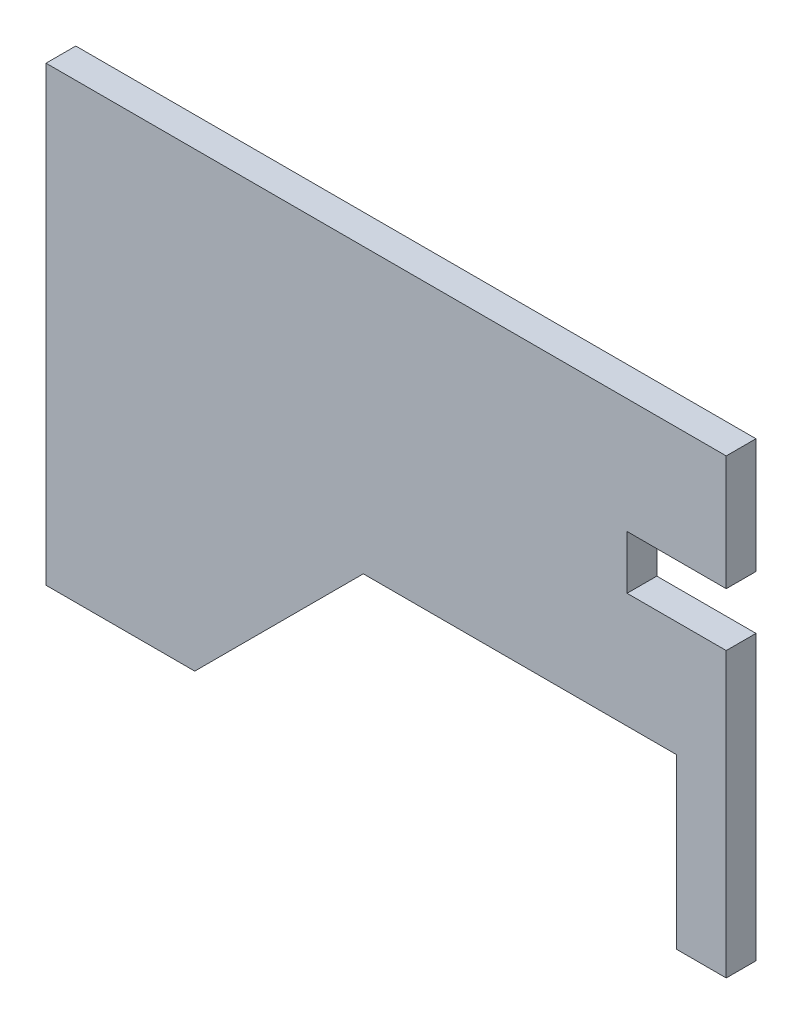
ISO-10303-21;
HEADER;
FILE_DESCRIPTION(('STEP AP214'),'2;1');
FILE_NAME('part.step','',(''),(''),'','','');
FILE_SCHEMA(('AUTOMOTIVE_DESIGN { 1 0 10303 214 1 1 1 1 }'));
ENDSEC;
DATA;
#1=APPLICATION_CONTEXT('core data for automotive mechanical design processes');
#2=APPLICATION_PROTOCOL_DEFINITION('international standard','automotive_design',2000,#1);
#3=PRODUCT_CONTEXT('',#1,'mechanical');
#4=PRODUCT('Part','Part','',(#3));
#5=PRODUCT_RELATED_PRODUCT_CATEGORY('part','',(#4));
#6=PRODUCT_DEFINITION_FORMATION('','',#4);
#7=PRODUCT_DEFINITION_CONTEXT('part definition',#1,'design');
#8=PRODUCT_DEFINITION('design','',#6,#7);
#9=PRODUCT_DEFINITION_SHAPE('','',#8);
#10=(LENGTH_UNIT() NAMED_UNIT(*) SI_UNIT(.MILLI.,.METRE.));
#11=(NAMED_UNIT(*) PLANE_ANGLE_UNIT() SI_UNIT($,.RADIAN.));
#12=(NAMED_UNIT(*) SI_UNIT($,.STERADIAN.) SOLID_ANGLE_UNIT());
#13=UNCERTAINTY_MEASURE_WITH_UNIT(LENGTH_MEASURE(1.E-05),#10,'distance_accuracy_value','');
#14=(GEOMETRIC_REPRESENTATION_CONTEXT(3) GLOBAL_UNCERTAINTY_ASSIGNED_CONTEXT((#13)) GLOBAL_UNIT_ASSIGNED_CONTEXT((#10,
#11,#12)) REPRESENTATION_CONTEXT('',''));
#15=CARTESIAN_POINT('',(0.,0.,0.));
#16=DIRECTION('',(0.,0.,1.));
#17=DIRECTION('',(1.,0.,0.));
#18=AXIS2_PLACEMENT_3D('',#15,#16,#17);
#19=CARTESIAN_POINT('',(0.,0.,0.));
#20=DIRECTION('',(0.,0.,1.));
#21=DIRECTION('',(1.,0.,0.));
#22=AXIS2_PLACEMENT_3D('',#19,#20,#21);
#23=PLANE('',#22);
#24=DIRECTION('',(0.,1.,0.));
#25=VECTOR('',#24,1.);
#26=CARTESIAN_POINT('',(23.,1.,0.));
#27=LINE('',#26,#25);
#28=CARTESIAN_POINT('',(23.,1.,0.));
#29=VERTEX_POINT('',#28);
#30=CARTESIAN_POINT('',(23.,4.6,0.));
#31=VERTEX_POINT('',#30);
#32=EDGE_CURVE('E216',#29,#31,#27,.T.);
#33=ORIENTED_EDGE('',*,*,#32,.F.);
#34=DIRECTION('',(1.,0.,0.));
#35=VECTOR('',#34,1.);
#36=CARTESIAN_POINT('',(26.,1.,0.));
#37=LINE('',#36,#35);
#38=CARTESIAN_POINT('',(-23.,0.999999999999993,0.));
#39=VERTEX_POINT('',#38);
#40=EDGE_CURVE('E340',#39,#29,#37,.T.);
#41=ORIENTED_EDGE('',*,*,#40,.F.);
#42=DIRECTION('',(0.,-1.,0.));
#43=VECTOR('',#42,1.);
#44=CARTESIAN_POINT('',(-23.,4.59999999999999,0.));
#45=LINE('',#44,#43);
#46=CARTESIAN_POINT('',(-23.,4.59999999999999,0.));
#47=VERTEX_POINT('',#46);
#48=EDGE_CURVE('E231',#47,#39,#45,.T.);
#49=ORIENTED_EDGE('',*,*,#48,.F.);
#50=DIRECTION('',(1.,0.,0.));
#51=VECTOR('',#50,1.);
#52=CARTESIAN_POINT('',(-23.,4.59999999999999,0.));
#53=LINE('',#52,#51);
#54=CARTESIAN_POINT('',(-26.,4.59999999999999,0.));
#55=VERTEX_POINT('',#54);
#56=EDGE_CURVE('E166',#55,#47,#53,.T.);
#57=ORIENTED_EDGE('',*,*,#56,.F.);
#58=DIRECTION('',(0.,-1.,0.));
#59=VECTOR('',#58,1.);
#60=CARTESIAN_POINT('',(-26.,11.,0.));
#61=LINE('',#60,#59);
#62=CARTESIAN_POINT('',(-26.,11.,0.));
#63=VERTEX_POINT('',#62);
#64=EDGE_CURVE('E228',#63,#55,#61,.T.);
#65=ORIENTED_EDGE('',*,*,#64,.F.);
#66=DIRECTION('',(-1.,0.,0.));
#67=VECTOR('',#66,1.);
#68=CARTESIAN_POINT('',(-26.,11.,0.));
#69=LINE('',#68,#67);
#70=CARTESIAN_POINT('',(36.,11.,0.));
#71=VERTEX_POINT('',#70);
#72=EDGE_CURVE('E226',#71,#63,#69,.T.);
#73=ORIENTED_EDGE('',*,*,#72,.F.);
#74=DIRECTION('',(0.,1.,0.));
#75=VECTOR('',#74,1.);
#76=CARTESIAN_POINT('',(36.,6.00000000000001,0.));
#77=LINE('',#76,#75);
#78=CARTESIAN_POINT('',(36.,6.00000000000001,0.));
#79=VERTEX_POINT('',#78);
#80=EDGE_CURVE('E224',#79,#71,#77,.T.);
#81=ORIENTED_EDGE('',*,*,#80,.F.);
#82=DIRECTION('',(1.,0.,0.));
#83=VECTOR('',#82,1.);
#84=CARTESIAN_POINT('',(36.,6.00000000000001,0.));
#85=LINE('',#84,#83);
#86=CARTESIAN_POINT('',(26.,6.00000000000001,0.));
#87=VERTEX_POINT('',#86);
#88=EDGE_CURVE('E222',#87,#79,#85,.T.);
#89=ORIENTED_EDGE('',*,*,#88,.F.);
#90=DIRECTION('',(0.,1.,0.));
#91=VECTOR('',#90,1.);
#92=CARTESIAN_POINT('',(26.,6.00000000000001,0.));
#93=LINE('',#92,#91);
#94=CARTESIAN_POINT('',(26.,4.6,0.));
#95=VERTEX_POINT('',#94);
#96=EDGE_CURVE('E220',#95,#87,#93,.T.);
#97=ORIENTED_EDGE('',*,*,#96,.F.);
#98=DIRECTION('',(1.,0.,0.));
#99=VECTOR('',#98,1.);
#100=CARTESIAN_POINT('',(23.,4.6,0.));
#101=LINE('',#100,#99);
#102=EDGE_CURVE('E218',#31,#95,#101,.T.);
#103=ORIENTED_EDGE('',*,*,#102,.F.);
#104=EDGE_LOOP('',(#33,#41,#49,#57,#65,#73,#81,#89,#97,#103));
#105=FACE_BOUND('',#104,.T.);
#106=ADVANCED_FACE('F33',(#105),#23,.F.);
#107=CARTESIAN_POINT('',(-26.,-11.,2.4));
#108=DIRECTION('',(1.,0.,0.));
#109=DIRECTION('',(0.,0.,-1.));
#110=AXIS2_PLACEMENT_3D('',#107,#108,#109);
#111=PLANE('',#110);
#112=DIRECTION('',(0.,-1.,0.));
#113=VECTOR('',#112,1.);
#114=CARTESIAN_POINT('',(-26.,-11.,0.));
#115=LINE('',#114,#113);
#116=CARTESIAN_POINT('',(-26.,-4.6,0.));
#117=VERTEX_POINT('',#116);
#118=CARTESIAN_POINT('',(-26.,-11.,0.));
#119=VERTEX_POINT('',#118);
#120=EDGE_CURVE('E199',#117,#119,#115,.T.);
#121=ORIENTED_EDGE('',*,*,#120,.T.);
#122=DIRECTION('',(0.,0.,-1.));
#123=VECTOR('',#122,1.);
#124=CARTESIAN_POINT('',(-26.,-11.,2.4));
#125=LINE('',#124,#123);
#126=CARTESIAN_POINT('',(-26.,-11.,2.4));
#127=VERTEX_POINT('',#126);
#128=EDGE_CURVE('E11',#127,#119,#125,.T.);
#129=ORIENTED_EDGE('',*,*,#128,.F.);
#130=DIRECTION('',(0.,-1.,0.));
#131=VECTOR('',#130,1.);
#132=CARTESIAN_POINT('',(-26.,-11.,2.4));
#133=LINE('',#132,#131);
#134=CARTESIAN_POINT('',(-26.,-4.6,2.4));
#135=VERTEX_POINT('',#134);
#136=EDGE_CURVE('E235',#135,#127,#133,.T.);
#137=ORIENTED_EDGE('',*,*,#136,.F.);
#138=DIRECTION('',(0.,0.,-1.));
#139=VECTOR('',#138,1.);
#140=CARTESIAN_POINT('',(-26.,-4.6,2.4));
#141=LINE('',#140,#139);
#142=EDGE_CURVE('E198',#135,#117,#141,.T.);
#143=ORIENTED_EDGE('',*,*,#142,.T.);
#144=EDGE_LOOP('',(#121,#129,#137,#143));
#145=FACE_BOUND('',#144,.T.);
#146=ADVANCED_FACE('F35',(#145),#111,.F.);
#147=CARTESIAN_POINT('',(-26.,-11.,2.4));
#148=DIRECTION('',(0.,1.,0.));
#149=DIRECTION('',(0.,0.,1.));
#150=AXIS2_PLACEMENT_3D('',#147,#148,#149);
#151=PLANE('',#150);
#152=DIRECTION('',(1.,0.,0.));
#153=VECTOR('',#152,1.);
#154=CARTESIAN_POINT('',(-26.,-11.,0.));
#155=LINE('',#154,#153);
#156=CARTESIAN_POINT('',(36.,-11.,0.));
#157=VERTEX_POINT('',#156);
#158=EDGE_CURVE('E202',#119,#157,#155,.T.);
#159=ORIENTED_EDGE('',*,*,#158,.T.);
#160=DIRECTION('',(0.,0.,-1.));
#161=VECTOR('',#160,1.);
#162=CARTESIAN_POINT('',(36.,-11.,2.4));
#163=LINE('',#162,#161);
#164=CARTESIAN_POINT('',(36.,-11.,2.4));
#165=VERTEX_POINT('',#164);
#166=EDGE_CURVE('E42',#165,#157,#163,.T.);
#167=ORIENTED_EDGE('',*,*,#166,.F.);
#168=DIRECTION('',(1.,0.,0.));
#169=VECTOR('',#168,1.);
#170=CARTESIAN_POINT('',(-26.,-11.,2.4));
#171=LINE('',#170,#169);
#172=EDGE_CURVE('E116',#127,#165,#171,.T.);
#173=ORIENTED_EDGE('',*,*,#172,.F.);
#174=ORIENTED_EDGE('',*,*,#128,.T.);
#175=EDGE_LOOP('',(#159,#167,#173,#174));
#176=FACE_BOUND('',#175,.T.);
#177=ADVANCED_FACE('F538',(#176),#151,.F.);
#178=CARTESIAN_POINT('',(36.,-6.,2.4));
#179=DIRECTION('',(-1.,0.,0.));
#180=DIRECTION('',(0.,0.,1.));
#181=AXIS2_PLACEMENT_3D('',#178,#179,#180);
#182=PLANE('',#181);
#183=DIRECTION('',(0.,1.,0.));
#184=VECTOR('',#183,1.);
#185=CARTESIAN_POINT('',(36.,-6.,0.));
#186=LINE('',#185,#184);
#187=CARTESIAN_POINT('',(36.,-6.,0.));
#188=VERTEX_POINT('',#187);
#189=EDGE_CURVE('E205',#157,#188,#186,.T.);
#190=ORIENTED_EDGE('',*,*,#189,.T.);
#191=DIRECTION('',(0.,0.,-1.));
#192=VECTOR('',#191,1.);
#193=CARTESIAN_POINT('',(36.,-6.,2.4));
#194=LINE('',#193,#192);
#195=CARTESIAN_POINT('',(36.,-6.,2.4));
#196=VERTEX_POINT('',#195);
#197=EDGE_CURVE('E275',#196,#188,#194,.T.);
#198=ORIENTED_EDGE('',*,*,#197,.F.);
#199=DIRECTION('',(0.,1.,0.));
#200=VECTOR('',#199,1.);
#201=CARTESIAN_POINT('',(36.,-6.,2.4));
#202=LINE('',#201,#200);
#203=EDGE_CURVE('E283',#165,#196,#202,.T.);
#204=ORIENTED_EDGE('',*,*,#203,.F.);
#205=ORIENTED_EDGE('',*,*,#166,.T.);
#206=EDGE_LOOP('',(#190,#198,#204,#205));
#207=FACE_BOUND('',#206,.T.);
#208=ADVANCED_FACE('F281',(#207),#182,.F.);
#209=CARTESIAN_POINT('',(36.,-6.,2.4));
#210=DIRECTION('',(0.,-1.,0.));
#211=DIRECTION('',(0.,0.,-1.));
#212=AXIS2_PLACEMENT_3D('',#209,#210,#211);
#213=PLANE('',#212);
#214=DIRECTION('',(-1.,0.,0.));
#215=VECTOR('',#214,1.);
#216=CARTESIAN_POINT('',(36.,-6.,0.));
#217=LINE('',#216,#215);
#218=CARTESIAN_POINT('',(26.,-6.,0.));
#219=VERTEX_POINT('',#218);
#220=EDGE_CURVE('E207',#188,#219,#217,.T.);
#221=ORIENTED_EDGE('',*,*,#220,.T.);
#222=DIRECTION('',(0.,0.,-1.));
#223=VECTOR('',#222,1.);
#224=CARTESIAN_POINT('',(26.,-6.,2.4));
#225=LINE('',#224,#223);
#226=CARTESIAN_POINT('',(26.,-6.,2.4));
#227=VERTEX_POINT('',#226);
#228=EDGE_CURVE('E272',#227,#219,#225,.T.);
#229=ORIENTED_EDGE('',*,*,#228,.F.);
#230=DIRECTION('',(-1.,0.,0.));
#231=VECTOR('',#230,1.);
#232=CARTESIAN_POINT('',(36.,-6.,2.4));
#233=LINE('',#232,#231);
#234=EDGE_CURVE('E302',#196,#227,#233,.T.);
#235=ORIENTED_EDGE('',*,*,#234,.F.);
#236=ORIENTED_EDGE('',*,*,#197,.T.);
#237=EDGE_LOOP('',(#221,#229,#235,#236));
#238=FACE_BOUND('',#237,.T.);
#239=ADVANCED_FACE('F291',(#238),#213,.F.);
#240=CARTESIAN_POINT('',(26.,-6.,2.4));
#241=DIRECTION('',(-1.,0.,0.));
#242=DIRECTION('',(0.,0.,1.));
#243=AXIS2_PLACEMENT_3D('',#240,#241,#242);
#244=PLANE('',#243);
#245=DIRECTION('',(0.,1.,0.));
#246=VECTOR('',#245,1.);
#247=CARTESIAN_POINT('',(26.,-6.,0.));
#248=LINE('',#247,#246);
#249=CARTESIAN_POINT('',(26.,-4.6,0.));
#250=VERTEX_POINT('',#249);
#251=EDGE_CURVE('E209',#219,#250,#248,.T.);
#252=ORIENTED_EDGE('',*,*,#251,.T.);
#253=DIRECTION('',(0.,0.,-1.));
#254=VECTOR('',#253,1.);
#255=CARTESIAN_POINT('',(26.,-4.6,2.4));
#256=LINE('',#255,#254);
#257=CARTESIAN_POINT('',(26.,-4.6,2.4));
#258=VERTEX_POINT('',#257);
#259=EDGE_CURVE('E269',#258,#250,#256,.T.);
#260=ORIENTED_EDGE('',*,*,#259,.F.);
#261=DIRECTION('',(0.,1.,0.));
#262=VECTOR('',#261,1.);
#263=CARTESIAN_POINT('',(26.,-6.,2.4));
#264=LINE('',#263,#262);
#265=EDGE_CURVE('E297',#227,#258,#264,.T.);
#266=ORIENTED_EDGE('',*,*,#265,.F.);
#267=ORIENTED_EDGE('',*,*,#228,.T.);
#268=EDGE_LOOP('',(#252,#260,#266,#267));
#269=FACE_BOUND('',#268,.T.);
#270=ADVANCED_FACE('F295',(#269),#244,.F.);
#271=CARTESIAN_POINT('',(23.,-4.6,2.4));
#272=DIRECTION('',(0.,-1.,0.));
#273=DIRECTION('',(0.,0.,-1.));
#274=AXIS2_PLACEMENT_3D('',#271,#272,#273);
#275=PLANE('',#274);
#276=DIRECTION('',(-1.,0.,0.));
#277=VECTOR('',#276,1.);
#278=CARTESIAN_POINT('',(23.,-4.6,0.));
#279=LINE('',#278,#277);
#280=CARTESIAN_POINT('',(23.,-4.6,0.));
#281=VERTEX_POINT('',#280);
#282=EDGE_CURVE('E211',#250,#281,#279,.T.);
#283=ORIENTED_EDGE('',*,*,#282,.T.);
#284=DIRECTION('',(0.,0.,-1.));
#285=VECTOR('',#284,1.);
#286=CARTESIAN_POINT('',(23.,-4.6,2.4));
#287=LINE('',#286,#285);
#288=CARTESIAN_POINT('',(23.,-4.6,2.4));
#289=VERTEX_POINT('',#288);
#290=EDGE_CURVE('E266',#289,#281,#287,.T.);
#291=ORIENTED_EDGE('',*,*,#290,.F.);
#292=DIRECTION('',(-1.,0.,0.));
#293=VECTOR('',#292,1.);
#294=CARTESIAN_POINT('',(23.,-4.6,2.4));
#295=LINE('',#294,#293);
#296=EDGE_CURVE('E301',#258,#289,#295,.T.);
#297=ORIENTED_EDGE('',*,*,#296,.F.);
#298=ORIENTED_EDGE('',*,*,#259,.T.);
#299=EDGE_LOOP('',(#283,#291,#297,#298));
#300=FACE_BOUND('',#299,.T.);
#301=ADVANCED_FACE('F501',(#300),#275,.F.);
#302=CARTESIAN_POINT('',(23.,-0.999999999999997,2.4));
#303=DIRECTION('',(-1.,0.,0.));
#304=DIRECTION('',(0.,0.,1.));
#305=AXIS2_PLACEMENT_3D('',#302,#303,#304);
#306=PLANE('',#305);
#307=DIRECTION('',(0.,1.,0.));
#308=VECTOR('',#307,1.);
#309=CARTESIAN_POINT('',(23.,-0.999999999999997,0.));
#310=LINE('',#309,#308);
#311=CARTESIAN_POINT('',(23.,-0.999999999999997,0.));
#312=VERTEX_POINT('',#311);
#313=EDGE_CURVE('E213',#281,#312,#310,.T.);
#314=ORIENTED_EDGE('',*,*,#313,.T.);
#315=DIRECTION('',(0.,0.,-1.));
#316=VECTOR('',#315,1.);
#317=CARTESIAN_POINT('',(23.,-0.999999999999997,2.4));
#318=LINE('',#317,#316);
#319=CARTESIAN_POINT('',(23.,-0.999999999999997,2.4));
#320=VERTEX_POINT('',#319);
#321=EDGE_CURVE('E263',#320,#312,#318,.T.);
#322=ORIENTED_EDGE('',*,*,#321,.F.);
#323=DIRECTION('',(0.,1.,0.));
#324=VECTOR('',#323,1.);
#325=CARTESIAN_POINT('',(23.,-0.999999999999997,2.4));
#326=LINE('',#325,#324);
#327=EDGE_CURVE('E310',#289,#320,#326,.T.);
#328=ORIENTED_EDGE('',*,*,#327,.F.);
#329=ORIENTED_EDGE('',*,*,#290,.T.);
#330=EDGE_LOOP('',(#314,#322,#328,#329));
#331=FACE_BOUND('',#330,.T.);
#332=ADVANCED_FACE('F498',(#331),#306,.F.);
#333=CARTESIAN_POINT('',(23.,1.,2.4));
#334=DIRECTION('',(-1.,0.,0.));
#335=DIRECTION('',(0.,0.,1.));
#336=AXIS2_PLACEMENT_3D('',#333,#334,#335);
#337=PLANE('',#336);
#338=ORIENTED_EDGE('',*,*,#32,.T.);
#339=DIRECTION('',(0.,0.,-1.));
#340=VECTOR('',#339,1.);
#341=CARTESIAN_POINT('',(23.,4.6,2.4));
#342=LINE('',#341,#340);
#343=CARTESIAN_POINT('',(23.,4.6,2.4));
#344=VERTEX_POINT('',#343);
#345=EDGE_CURVE('E257',#344,#31,#342,.T.);
#346=ORIENTED_EDGE('',*,*,#345,.F.);
#347=DIRECTION('',(0.,1.,0.));
#348=VECTOR('',#347,1.);
#349=CARTESIAN_POINT('',(23.,1.,2.4));
#350=LINE('',#349,#348);
#351=CARTESIAN_POINT('',(23.,1.,2.4));
#352=VERTEX_POINT('',#351);
#353=EDGE_CURVE('E313',#352,#344,#350,.T.);
#354=ORIENTED_EDGE('',*,*,#353,.F.);
#355=DIRECTION('',(0.,0.,-1.));
#356=VECTOR('',#355,1.);
#357=CARTESIAN_POINT('',(23.,1.,2.4));
#358=LINE('',#357,#356);
#359=EDGE_CURVE('E260',#352,#29,#358,.T.);
#360=ORIENTED_EDGE('',*,*,#359,.T.);
#361=EDGE_LOOP('',(#338,#346,#354,#360));
#362=FACE_BOUND('',#361,.T.);
#363=ADVANCED_FACE('F509',(#362),#337,.F.);
#364=CARTESIAN_POINT('',(23.,4.6,2.4));
#365=DIRECTION('',(0.,1.,0.));
#366=DIRECTION('',(0.,0.,1.));
#367=AXIS2_PLACEMENT_3D('',#364,#365,#366);
#368=PLANE('',#367);
#369=ORIENTED_EDGE('',*,*,#102,.T.);
#370=DIRECTION('',(0.,0.,-1.));
#371=VECTOR('',#370,1.);
#372=CARTESIAN_POINT('',(26.,4.6,2.4));
#373=LINE('',#372,#371);
#374=CARTESIAN_POINT('',(26.,4.6,2.4));
#375=VERTEX_POINT('',#374);
#376=EDGE_CURVE('E254',#375,#95,#373,.T.);
#377=ORIENTED_EDGE('',*,*,#376,.F.);
#378=DIRECTION('',(1.,0.,0.));
#379=VECTOR('',#378,1.);
#380=CARTESIAN_POINT('',(23.,4.6,2.4));
#381=LINE('',#380,#379);
#382=EDGE_CURVE('E316',#344,#375,#381,.T.);
#383=ORIENTED_EDGE('',*,*,#382,.F.);
#384=ORIENTED_EDGE('',*,*,#345,.T.);
#385=EDGE_LOOP('',(#369,#377,#383,#384));
#386=FACE_BOUND('',#385,.T.);
#387=ADVANCED_FACE('F513',(#386),#368,.F.);
#388=CARTESIAN_POINT('',(26.,6.00000000000001,2.4));
#389=DIRECTION('',(-1.,0.,0.));
#390=DIRECTION('',(0.,0.,1.));
#391=AXIS2_PLACEMENT_3D('',#388,#389,#390);
#392=PLANE('',#391);
#393=ORIENTED_EDGE('',*,*,#96,.T.);
#394=DIRECTION('',(0.,0.,-1.));
#395=VECTOR('',#394,1.);
#396=CARTESIAN_POINT('',(26.,6.00000000000001,2.4));
#397=LINE('',#396,#395);
#398=CARTESIAN_POINT('',(26.,6.00000000000001,2.4));
#399=VERTEX_POINT('',#398);
#400=EDGE_CURVE('E251',#399,#87,#397,.T.);
#401=ORIENTED_EDGE('',*,*,#400,.F.);
#402=DIRECTION('',(0.,1.,0.));
#403=VECTOR('',#402,1.);
#404=CARTESIAN_POINT('',(26.,6.00000000000001,2.4));
#405=LINE('',#404,#403);
#406=EDGE_CURVE('E319',#375,#399,#405,.T.);
#407=ORIENTED_EDGE('',*,*,#406,.F.);
#408=ORIENTED_EDGE('',*,*,#376,.T.);
#409=EDGE_LOOP('',(#393,#401,#407,#408));
#410=FACE_BOUND('',#409,.T.);
#411=ADVANCED_FACE('F517',(#410),#392,.F.);
#412=CARTESIAN_POINT('',(36.,6.00000000000001,2.4));
#413=DIRECTION('',(0.,1.,0.));
#414=DIRECTION('',(0.,0.,1.));
#415=AXIS2_PLACEMENT_3D('',#412,#413,#414);
#416=PLANE('',#415);
#417=ORIENTED_EDGE('',*,*,#88,.T.);
#418=DIRECTION('',(0.,0.,-1.));
#419=VECTOR('',#418,1.);
#420=CARTESIAN_POINT('',(36.,6.00000000000001,2.4));
#421=LINE('',#420,#419);
#422=CARTESIAN_POINT('',(36.,6.00000000000001,2.4));
#423=VERTEX_POINT('',#422);
#424=EDGE_CURVE('E248',#423,#79,#421,.T.);
#425=ORIENTED_EDGE('',*,*,#424,.F.);
#426=DIRECTION('',(1.,0.,0.));
#427=VECTOR('',#426,1.);
#428=CARTESIAN_POINT('',(36.,6.00000000000001,2.4));
#429=LINE('',#428,#427);
#430=EDGE_CURVE('E322',#399,#423,#429,.T.);
#431=ORIENTED_EDGE('',*,*,#430,.F.);
#432=ORIENTED_EDGE('',*,*,#400,.T.);
#433=EDGE_LOOP('',(#417,#425,#431,#432));
#434=FACE_BOUND('',#433,.T.);
#435=ADVANCED_FACE('F521',(#434),#416,.F.);
#436=CARTESIAN_POINT('',(36.,6.00000000000001,2.4));
#437=DIRECTION('',(-1.,0.,0.));
#438=DIRECTION('',(0.,-1.,0.));
#439=AXIS2_PLACEMENT_3D('',#436,#437,#438);
#440=PLANE('',#439);
#441=ORIENTED_EDGE('',*,*,#80,.T.);
#442=DIRECTION('',(0.,0.,-1.));
#443=VECTOR('',#442,1.);
#444=CARTESIAN_POINT('',(36.,11.,2.4));
#445=LINE('',#444,#443);
#446=CARTESIAN_POINT('',(36.,11.,2.4));
#447=VERTEX_POINT('',#446);
#448=EDGE_CURVE('E245',#447,#71,#445,.T.);
#449=ORIENTED_EDGE('',*,*,#448,.F.);
#450=DIRECTION('',(0.,1.,0.));
#451=VECTOR('',#450,1.);
#452=CARTESIAN_POINT('',(36.,6.00000000000001,2.4));
#453=LINE('',#452,#451);
#454=EDGE_CURVE('E325',#423,#447,#453,.T.);
#455=ORIENTED_EDGE('',*,*,#454,.F.);
#456=ORIENTED_EDGE('',*,*,#424,.T.);
#457=EDGE_LOOP('',(#441,#449,#455,#456));
#458=FACE_BOUND('',#457,.T.);
#459=ADVANCED_FACE('F524',(#458),#440,.F.);
#460=CARTESIAN_POINT('',(-26.,11.,2.4));
#461=DIRECTION('',(0.,-1.,0.));
#462=DIRECTION('',(0.,0.,-1.));
#463=AXIS2_PLACEMENT_3D('',#460,#461,#462);
#464=PLANE('',#463);
#465=ORIENTED_EDGE('',*,*,#72,.T.);
#466=DIRECTION('',(0.,0.,-1.));
#467=VECTOR('',#466,1.);
#468=CARTESIAN_POINT('',(-26.,11.,2.4));
#469=LINE('',#468,#467);
#470=CARTESIAN_POINT('',(-26.,11.,2.4));
#471=VERTEX_POINT('',#470);
#472=EDGE_CURVE('E242',#471,#63,#469,.T.);
#473=ORIENTED_EDGE('',*,*,#472,.F.);
#474=DIRECTION('',(-1.,0.,0.));
#475=VECTOR('',#474,1.);
#476=CARTESIAN_POINT('',(-26.,11.,2.4));
#477=LINE('',#476,#475);
#478=EDGE_CURVE('E189',#447,#471,#477,.T.);
#479=ORIENTED_EDGE('',*,*,#478,.F.);
#480=ORIENTED_EDGE('',*,*,#448,.T.);
#481=EDGE_LOOP('',(#465,#473,#479,#480));
#482=FACE_BOUND('',#481,.T.);
#483=ADVANCED_FACE('F330',(#482),#464,.F.);
#484=CARTESIAN_POINT('',(-26.,11.,2.4));
#485=DIRECTION('',(1.,0.,0.));
#486=DIRECTION('',(0.,0.,-1.));
#487=AXIS2_PLACEMENT_3D('',#484,#485,#486);
#488=PLANE('',#487);
#489=ORIENTED_EDGE('',*,*,#64,.T.);
#490=DIRECTION('',(0.,0.,-1.));
#491=VECTOR('',#490,1.);
#492=CARTESIAN_POINT('',(-26.,4.59999999999999,2.4));
#493=LINE('',#492,#491);
#494=CARTESIAN_POINT('',(-26.,4.59999999999999,2.4));
#495=VERTEX_POINT('',#494);
#496=EDGE_CURVE('E170',#495,#55,#493,.T.);
#497=ORIENTED_EDGE('',*,*,#496,.F.);
#498=DIRECTION('',(0.,-1.,0.));
#499=VECTOR('',#498,1.);
#500=CARTESIAN_POINT('',(-26.,11.,2.4));
#501=LINE('',#500,#499);
#502=EDGE_CURVE('E187',#471,#495,#501,.T.);
#503=ORIENTED_EDGE('',*,*,#502,.F.);
#504=ORIENTED_EDGE('',*,*,#472,.T.);
#505=EDGE_LOOP('',(#489,#497,#503,#504));
#506=FACE_BOUND('',#505,.T.);
#507=ADVANCED_FACE('F334',(#506),#488,.F.);
#508=CARTESIAN_POINT('',(-23.,4.59999999999999,2.4));
#509=DIRECTION('',(0.,1.,0.));
#510=DIRECTION('',(0.,0.,1.));
#511=AXIS2_PLACEMENT_3D('',#508,#509,#510);
#512=PLANE('',#511);
#513=ORIENTED_EDGE('',*,*,#56,.T.);
#514=DIRECTION('',(0.,0.,-1.));
#515=VECTOR('',#514,1.);
#516=CARTESIAN_POINT('',(-23.,4.59999999999999,2.4));
#517=LINE('',#516,#515);
#518=CARTESIAN_POINT('',(-23.,4.59999999999999,2.4));
#519=VERTEX_POINT('',#518);
#520=EDGE_CURVE('E158',#519,#47,#517,.T.);
#521=ORIENTED_EDGE('',*,*,#520,.F.);
#522=DIRECTION('',(1.,0.,0.));
#523=VECTOR('',#522,1.);
#524=CARTESIAN_POINT('',(-23.,4.59999999999999,2.4));
#525=LINE('',#524,#523);
#526=EDGE_CURVE('E163',#495,#519,#525,.T.);
#527=ORIENTED_EDGE('',*,*,#526,.F.);
#528=ORIENTED_EDGE('',*,*,#496,.T.);
#529=EDGE_LOOP('',(#513,#521,#527,#528));
#530=FACE_BOUND('',#529,.T.);
#531=ADVANCED_FACE('F160',(#530),#512,.F.);
#532=CARTESIAN_POINT('',(-23.,4.59999999999999,2.4));
#533=DIRECTION('',(1.,0.,0.));
#534=DIRECTION('',(0.,0.,-1.));
#535=AXIS2_PLACEMENT_3D('',#532,#533,#534);
#536=PLANE('',#535);
#537=ORIENTED_EDGE('',*,*,#48,.T.);
#538=DIRECTION('',(0.,0.,-1.));
#539=VECTOR('',#538,1.);
#540=CARTESIAN_POINT('',(-23.,0.999999999999992,2.4));
#541=LINE('',#540,#539);
#542=CARTESIAN_POINT('',(-23.,0.999999999999993,2.4));
#543=VERTEX_POINT('',#542);
#544=EDGE_CURVE('E171',#543,#39,#541,.T.);
#545=ORIENTED_EDGE('',*,*,#544,.F.);
#546=DIRECTION('',(0.,-1.,0.));
#547=VECTOR('',#546,1.);
#548=CARTESIAN_POINT('',(-23.,4.59999999999999,2.4));
#549=LINE('',#548,#547);
#550=EDGE_CURVE('E175',#519,#543,#549,.T.);
#551=ORIENTED_EDGE('',*,*,#550,.F.);
#552=ORIENTED_EDGE('',*,*,#520,.T.);
#553=EDGE_LOOP('',(#537,#545,#551,#552));
#554=FACE_BOUND('',#553,.T.);
#555=ADVANCED_FACE('F176',(#554),#536,.F.);
#556=CARTESIAN_POINT('',(-23.,-4.6,2.4));
#557=DIRECTION('',(1.,0.,0.));
#558=DIRECTION('',(0.,0.,-1.));
#559=AXIS2_PLACEMENT_3D('',#556,#557,#558);
#560=PLANE('',#559);
#561=DIRECTION('',(0.,-1.,0.));
#562=VECTOR('',#561,1.);
#563=CARTESIAN_POINT('',(-23.,-4.6,0.));
#564=LINE('',#563,#562);
#565=CARTESIAN_POINT('',(-23.,-0.999999999999997,0.));
#566=VERTEX_POINT('',#565);
#567=CARTESIAN_POINT('',(-23.,-4.6,0.));
#568=VERTEX_POINT('',#567);
#569=EDGE_CURVE('E102',#566,#568,#564,.T.);
#570=ORIENTED_EDGE('',*,*,#569,.T.);
#571=DIRECTION('',(0.,0.,-1.));
#572=VECTOR('',#571,1.);
#573=CARTESIAN_POINT('',(-23.,-4.6,2.4));
#574=LINE('',#573,#572);
#575=CARTESIAN_POINT('',(-23.,-4.6,2.4));
#576=VERTEX_POINT('',#575);
#577=EDGE_CURVE('E50',#576,#568,#574,.T.);
#578=ORIENTED_EDGE('',*,*,#577,.F.);
#579=DIRECTION('',(0.,-1.,0.));
#580=VECTOR('',#579,1.);
#581=CARTESIAN_POINT('',(-23.,-4.6,2.4));
#582=LINE('',#581,#580);
#583=CARTESIAN_POINT('',(-23.,-0.999999999999997,2.4));
#584=VERTEX_POINT('',#583);
#585=EDGE_CURVE('E181',#584,#576,#582,.T.);
#586=ORIENTED_EDGE('',*,*,#585,.F.);
#587=DIRECTION('',(0.,0.,-1.));
#588=VECTOR('',#587,1.);
#589=CARTESIAN_POINT('',(-23.,-0.999999999999997,2.4));
#590=LINE('',#589,#588);
#591=EDGE_CURVE('E238',#584,#566,#590,.T.);
#592=ORIENTED_EDGE('',*,*,#591,.T.);
#593=EDGE_LOOP('',(#570,#578,#586,#592));
#594=FACE_BOUND('',#593,.T.);
#595=ADVANCED_FACE('F484',(#594),#560,.F.);
#596=CARTESIAN_POINT('',(-23.,-4.6,2.4));
#597=DIRECTION('',(0.,-1.,0.));
#598=DIRECTION('',(0.,0.,-1.));
#599=AXIS2_PLACEMENT_3D('',#596,#597,#598);
#600=PLANE('',#599);
#601=DIRECTION('',(-1.,0.,0.));
#602=VECTOR('',#601,1.);
#603=CARTESIAN_POINT('',(-23.,-4.6,0.));
#604=LINE('',#603,#602);
#605=EDGE_CURVE('E108',#568,#117,#604,.T.);
#606=ORIENTED_EDGE('',*,*,#605,.T.);
#607=ORIENTED_EDGE('',*,*,#142,.F.);
#608=DIRECTION('',(-1.,0.,0.));
#609=VECTOR('',#608,1.);
#610=CARTESIAN_POINT('',(-23.,-4.6,2.4));
#611=LINE('',#610,#609);
#612=EDGE_CURVE('E195',#576,#135,#611,.T.);
#613=ORIENTED_EDGE('',*,*,#612,.F.);
#614=ORIENTED_EDGE('',*,*,#577,.T.);
#615=EDGE_LOOP('',(#606,#607,#613,#614));
#616=FACE_BOUND('',#615,.T.);
#617=ADVANCED_FACE('F481',(#616),#600,.F.);
#618=ORIENTED_EDGE('',*,*,#569,.F.);
#619=DIRECTION('',(-1.,0.,0.));
#620=VECTOR('',#619,1.);
#621=CARTESIAN_POINT('',(-26.,-0.999999999999997,0.));
#622=LINE('',#621,#620);
#623=EDGE_CURVE('E492',#312,#566,#622,.T.);
#624=ORIENTED_EDGE('',*,*,#623,.F.);
#625=ORIENTED_EDGE('',*,*,#313,.F.);
#626=ORIENTED_EDGE('',*,*,#282,.F.);
#627=ORIENTED_EDGE('',*,*,#251,.F.);
#628=ORIENTED_EDGE('',*,*,#220,.F.);
#629=ORIENTED_EDGE('',*,*,#189,.F.);
#630=ORIENTED_EDGE('',*,*,#158,.F.);
#631=ORIENTED_EDGE('',*,*,#120,.F.);
#632=ORIENTED_EDGE('',*,*,#605,.F.);
#633=EDGE_LOOP('',(#618,#624,#625,#626,#627,#628,#629,#630,#631,#632));
#634=FACE_BOUND('',#633,.T.);
#635=ADVANCED_FACE('F286',(#634),#23,.F.);
#636=CARTESIAN_POINT('',(39.3,-2.70000000000001,5.4));
#637=DIRECTION('',(0.,-1.,0.));
#638=DIRECTION('',(1.,0.,0.));
#639=AXIS2_PLACEMENT_3D('',#636,#637,#638);
#640=PLANE('',#639);
#641=DIRECTION('',(-1.,0.,0.));
#642=VECTOR('',#641,1.);
#643=CARTESIAN_POINT('',(39.3,-2.70000000000001,2.4));
#644=LINE('',#643,#642);
#645=CARTESIAN_POINT('',(39.3,-2.70000000000001,2.4));
#646=VERTEX_POINT('',#645);
#647=CARTESIAN_POINT('',(29.3,-2.70000000000001,2.4));
#648=VERTEX_POINT('',#647);
#649=EDGE_CURVE('E428',#646,#648,#644,.T.);
#650=ORIENTED_EDGE('',*,*,#649,.T.);
#651=DIRECTION('',(0.,0.,-1.));
#652=VECTOR('',#651,1.);
#653=CARTESIAN_POINT('',(29.3,-2.70000000000001,5.4));
#654=LINE('',#653,#652);
#655=CARTESIAN_POINT('',(29.3,-2.70000000000001,5.4));
#656=VERTEX_POINT('',#655);
#657=EDGE_CURVE('E203',#656,#648,#654,.T.);
#658=ORIENTED_EDGE('',*,*,#657,.F.);
#659=DIRECTION('',(-1.,0.,0.));
#660=VECTOR('',#659,1.);
#661=CARTESIAN_POINT('',(39.3,-2.70000000000001,5.4));
#662=LINE('',#661,#660);
#663=CARTESIAN_POINT('',(39.3,-2.70000000000001,5.4));
#664=VERTEX_POINT('',#663);
#665=EDGE_CURVE('E430',#664,#656,#662,.T.);
#666=ORIENTED_EDGE('',*,*,#665,.F.);
#667=DIRECTION('',(0.,0.,-1.));
#668=VECTOR('',#667,1.);
#669=CARTESIAN_POINT('',(39.3,-2.70000000000001,5.4));
#670=LINE('',#669,#668);
#671=EDGE_CURVE('E424',#664,#646,#670,.T.);
#672=ORIENTED_EDGE('',*,*,#671,.T.);
#673=EDGE_LOOP('',(#650,#658,#666,#672));
#674=FACE_BOUND('',#673,.T.);
#675=ADVANCED_FACE('F426',(#674),#640,.F.);
#676=CARTESIAN_POINT('',(29.3,-2.70000000000001,5.4));
#677=DIRECTION('',(-1.,0.,0.));
#678=DIRECTION('',(0.,0.,1.));
#679=AXIS2_PLACEMENT_3D('',#676,#677,#678);
#680=PLANE('',#679);
#681=DIRECTION('',(0.,1.,0.));
#682=VECTOR('',#681,1.);
#683=CARTESIAN_POINT('',(29.3,-2.70000000000001,2.4));
#684=LINE('',#683,#682);
#685=CARTESIAN_POINT('',(29.3,2.69999999999999,2.4));
#686=VERTEX_POINT('',#685);
#687=EDGE_CURVE('E442',#648,#686,#684,.T.);
#688=ORIENTED_EDGE('',*,*,#687,.T.);
#689=DIRECTION('',(0.,0.,-1.));
#690=VECTOR('',#689,1.);
#691=CARTESIAN_POINT('',(29.3,2.69999999999999,5.4));
#692=LINE('',#691,#690);
#693=CARTESIAN_POINT('',(29.3,2.69999999999999,5.4));
#694=VERTEX_POINT('',#693);
#695=EDGE_CURVE('E475',#694,#686,#692,.T.);
#696=ORIENTED_EDGE('',*,*,#695,.F.);
#697=DIRECTION('',(0.,1.,0.));
#698=VECTOR('',#697,1.);
#699=CARTESIAN_POINT('',(29.3,-2.70000000000001,5.4));
#700=LINE('',#699,#698);
#701=EDGE_CURVE('E450',#656,#694,#700,.T.);
#702=ORIENTED_EDGE('',*,*,#701,.F.);
#703=ORIENTED_EDGE('',*,*,#657,.T.);
#704=EDGE_LOOP('',(#688,#696,#702,#703));
#705=FACE_BOUND('',#704,.T.);
#706=ADVANCED_FACE('F546',(#705),#680,.F.);
#707=CARTESIAN_POINT('',(39.3,2.69999999999999,5.4));
#708=DIRECTION('',(0.,-1.,0.));
#709=DIRECTION('',(1.,0.,0.));
#710=AXIS2_PLACEMENT_3D('',#707,#708,#709);
#711=PLANE('',#710);
#712=DIRECTION('',(-1.,0.,0.));
#713=VECTOR('',#712,1.);
#714=CARTESIAN_POINT('',(39.3,2.69999999999999,2.4));
#715=LINE('',#714,#713);
#716=CARTESIAN_POINT('',(39.3,2.69999999999999,2.4));
#717=VERTEX_POINT('',#716);
#718=EDGE_CURVE('E660',#717,#686,#715,.T.);
#719=ORIENTED_EDGE('',*,*,#718,.F.);
#720=DIRECTION('',(0.,0.,-1.));
#721=VECTOR('',#720,1.);
#722=CARTESIAN_POINT('',(39.3,2.69999999999999,5.4));
#723=LINE('',#722,#721);
#724=CARTESIAN_POINT('',(39.3,2.69999999999999,5.4));
#725=VERTEX_POINT('',#724);
#726=EDGE_CURVE('E473',#725,#717,#723,.T.);
#727=ORIENTED_EDGE('',*,*,#726,.F.);
#728=DIRECTION('',(-1.,0.,0.));
#729=VECTOR('',#728,1.);
#730=CARTESIAN_POINT('',(39.3,2.69999999999999,5.4));
#731=LINE('',#730,#729);
#732=EDGE_CURVE('E708',#725,#694,#731,.T.);
#733=ORIENTED_EDGE('',*,*,#732,.T.);
#734=ORIENTED_EDGE('',*,*,#695,.T.);
#735=EDGE_LOOP('',(#719,#727,#733,#734));
#736=FACE_BOUND('',#735,.T.);
#737=ADVANCED_FACE('F649',(#736),#711,.T.);
#738=CARTESIAN_POINT('',(39.3,2.69999999999999,5.4));
#739=DIRECTION('',(-1.,0.,0.));
#740=DIRECTION('',(0.,-1.,0.));
#741=AXIS2_PLACEMENT_3D('',#738,#739,#740);
#742=PLANE('',#741);
#743=DIRECTION('',(0.,1.,0.));
#744=VECTOR('',#743,1.);
#745=CARTESIAN_POINT('',(39.3,2.69999999999999,2.4));
#746=LINE('',#745,#744);
#747=CARTESIAN_POINT('',(39.3,14.3,2.4));
#748=VERTEX_POINT('',#747);
#749=EDGE_CURVE('E665',#717,#748,#746,.T.);
#750=ORIENTED_EDGE('',*,*,#749,.T.);
#751=DIRECTION('',(0.,0.,-1.));
#752=VECTOR('',#751,1.);
#753=CARTESIAN_POINT('',(39.3,14.3,5.4));
#754=LINE('',#753,#752);
#755=CARTESIAN_POINT('',(39.3,14.3,5.4));
#756=VERTEX_POINT('',#755);
#757=EDGE_CURVE('E470',#756,#748,#754,.T.);
#758=ORIENTED_EDGE('',*,*,#757,.F.);
#759=DIRECTION('',(0.,1.,0.));
#760=VECTOR('',#759,1.);
#761=CARTESIAN_POINT('',(39.3,2.69999999999999,5.4));
#762=LINE('',#761,#760);
#763=EDGE_CURVE('E706',#725,#756,#762,.T.);
#764=ORIENTED_EDGE('',*,*,#763,.F.);
#765=ORIENTED_EDGE('',*,*,#726,.T.);
#766=EDGE_LOOP('',(#750,#758,#764,#765));
#767=FACE_BOUND('',#766,.T.);
#768=ADVANCED_FACE('F645',(#767),#742,.F.);
#769=CARTESIAN_POINT('',(-29.3,14.3,5.4));
#770=DIRECTION('',(0.,1.,0.));
#771=DIRECTION('',(-1.,0.,0.));
#772=AXIS2_PLACEMENT_3D('',#769,#770,#771);
#773=PLANE('',#772);
#774=DIRECTION('',(1.,0.,0.));
#775=VECTOR('',#774,1.);
#776=CARTESIAN_POINT('',(-29.3,14.3,2.4));
#777=LINE('',#776,#775);
#778=CARTESIAN_POINT('',(-29.3,14.3,2.4));
#779=VERTEX_POINT('',#778);
#780=EDGE_CURVE('E667',#779,#748,#777,.T.);
#781=ORIENTED_EDGE('',*,*,#780,.F.);
#782=DIRECTION('',(0.,0.,-1.));
#783=VECTOR('',#782,1.);
#784=CARTESIAN_POINT('',(-29.3,14.3,5.4));
#785=LINE('',#784,#783);
#786=CARTESIAN_POINT('',(-29.3,14.3,5.4));
#787=VERTEX_POINT('',#786);
#788=EDGE_CURVE('E467',#787,#779,#785,.T.);
#789=ORIENTED_EDGE('',*,*,#788,.F.);
#790=DIRECTION('',(-1.,0.,0.));
#791=VECTOR('',#790,1.);
#792=CARTESIAN_POINT('',(39.3,14.3,5.4));
#793=LINE('',#792,#791);
#794=EDGE_CURVE('E710',#756,#787,#793,.T.);
#795=ORIENTED_EDGE('',*,*,#794,.F.);
#796=ORIENTED_EDGE('',*,*,#757,.T.);
#797=EDGE_LOOP('',(#781,#789,#795,#796));
#798=FACE_BOUND('',#797,.T.);
#799=ADVANCED_FACE('F641',(#798),#773,.T.);
#800=CARTESIAN_POINT('',(-29.3,-14.3,5.4));
#801=DIRECTION('',(1.,0.,0.));
#802=DIRECTION('',(0.,0.,-1.));
#803=AXIS2_PLACEMENT_3D('',#800,#801,#802);
#804=PLANE('',#803);
#805=DIRECTION('',(0.,-1.,0.));
#806=VECTOR('',#805,1.);
#807=CARTESIAN_POINT('',(-29.3,-14.3,2.4));
#808=LINE('',#807,#806);
#809=CARTESIAN_POINT('',(-29.3,-31.3,2.4));
#810=VERTEX_POINT('',#809);
#811=EDGE_CURVE('E671',#779,#810,#808,.T.);
#812=ORIENTED_EDGE('',*,*,#811,.T.);
#813=DIRECTION('',(0.,0.,-1.));
#814=VECTOR('',#813,1.);
#815=CARTESIAN_POINT('',(-29.3,-31.3,5.4));
#816=LINE('',#815,#814);
#817=CARTESIAN_POINT('',(-29.3,-31.3,5.4));
#818=VERTEX_POINT('',#817);
#819=EDGE_CURVE('E465',#818,#810,#816,.T.);
#820=ORIENTED_EDGE('',*,*,#819,.F.);
#821=DIRECTION('',(0.,1.,0.));
#822=VECTOR('',#821,1.);
#823=CARTESIAN_POINT('',(-29.3,-14.3,5.4));
#824=LINE('',#823,#822);
#825=EDGE_CURVE('E702',#818,#787,#824,.T.);
#826=ORIENTED_EDGE('',*,*,#825,.T.);
#827=ORIENTED_EDGE('',*,*,#788,.T.);
#828=EDGE_LOOP('',(#812,#820,#826,#827));
#829=FACE_BOUND('',#828,.T.);
#830=ADVANCED_FACE('F637',(#829),#804,.F.);
#831=CARTESIAN_POINT('',(-14.3,-31.3,5.4));
#832=DIRECTION('',(0.,-1.,0.));
#833=DIRECTION('',(0.,0.,-1.));
#834=AXIS2_PLACEMENT_3D('',#831,#832,#833);
#835=PLANE('',#834);
#836=DIRECTION('',(-1.,0.,0.));
#837=VECTOR('',#836,1.);
#838=CARTESIAN_POINT('',(-14.3,-31.3,2.4));
#839=LINE('',#838,#837);
#840=CARTESIAN_POINT('',(-14.3,-31.3,2.4));
#841=VERTEX_POINT('',#840);
#842=EDGE_CURVE('E674',#841,#810,#839,.T.);
#843=ORIENTED_EDGE('',*,*,#842,.F.);
#844=DIRECTION('',(0.,0.,-1.));
#845=VECTOR('',#844,1.);
#846=CARTESIAN_POINT('',(-14.3,-31.3,5.4));
#847=LINE('',#846,#845);
#848=CARTESIAN_POINT('',(-14.3,-31.3,5.4));
#849=VERTEX_POINT('',#848);
#850=EDGE_CURVE('E463',#849,#841,#847,.T.);
#851=ORIENTED_EDGE('',*,*,#850,.F.);
#852=DIRECTION('',(-1.,0.,0.));
#853=VECTOR('',#852,1.);
#854=CARTESIAN_POINT('',(-14.3,-31.3,5.4));
#855=LINE('',#854,#853);
#856=EDGE_CURVE('E698',#849,#818,#855,.T.);
#857=ORIENTED_EDGE('',*,*,#856,.T.);
#858=ORIENTED_EDGE('',*,*,#819,.T.);
#859=EDGE_LOOP('',(#843,#851,#857,#858));
#860=FACE_BOUND('',#859,.T.);
#861=ADVANCED_FACE('F633',(#860),#835,.T.);
#862=CARTESIAN_POINT('',(2.69999999999999,-14.3,5.4));
#863=DIRECTION('',(0.707106781186547,-0.707106781186548,0.));
#864=DIRECTION('',(0.707106781186548,0.707106781186547,0.));
#865=AXIS2_PLACEMENT_3D('',#862,#863,#864);
#866=PLANE('',#865);
#867=DIRECTION('',(-0.707106781186548,-0.707106781186547,0.));
#868=VECTOR('',#867,1.);
#869=CARTESIAN_POINT('',(2.69999999999999,-14.3,2.4));
#870=LINE('',#869,#868);
#871=CARTESIAN_POINT('',(2.69999999999999,-14.3,2.4));
#872=VERTEX_POINT('',#871);
#873=EDGE_CURVE('E677',#872,#841,#870,.T.);
#874=ORIENTED_EDGE('',*,*,#873,.F.);
#875=DIRECTION('',(0.,0.,-1.));
#876=VECTOR('',#875,1.);
#877=CARTESIAN_POINT('',(2.69999999999999,-14.3,5.4));
#878=LINE('',#877,#876);
#879=CARTESIAN_POINT('',(2.69999999999999,-14.3,5.4));
#880=VERTEX_POINT('',#879);
#881=EDGE_CURVE('E461',#880,#872,#878,.T.);
#882=ORIENTED_EDGE('',*,*,#881,.F.);
#883=DIRECTION('',(-0.707106781186548,-0.707106781186547,0.));
#884=VECTOR('',#883,1.);
#885=CARTESIAN_POINT('',(2.69999999999999,-14.3,5.4));
#886=LINE('',#885,#884);
#887=EDGE_CURVE('E717',#880,#849,#886,.T.);
#888=ORIENTED_EDGE('',*,*,#887,.T.);
#889=ORIENTED_EDGE('',*,*,#850,.T.);
#890=EDGE_LOOP('',(#874,#882,#888,#889));
#891=FACE_BOUND('',#890,.T.);
#892=ADVANCED_FACE('F629',(#891),#866,.T.);
#893=CARTESIAN_POINT('',(34.3,-14.3,5.4));
#894=DIRECTION('',(0.,-1.,0.));
#895=DIRECTION('',(1.,0.,0.));
#896=AXIS2_PLACEMENT_3D('',#893,#894,#895);
#897=PLANE('',#896);
#898=DIRECTION('',(-1.,0.,0.));
#899=VECTOR('',#898,1.);
#900=CARTESIAN_POINT('',(34.3,-14.3,2.4));
#901=LINE('',#900,#899);
#902=CARTESIAN_POINT('',(34.3,-14.3,2.4));
#903=VERTEX_POINT('',#902);
#904=EDGE_CURVE('E680',#903,#872,#901,.T.);
#905=ORIENTED_EDGE('',*,*,#904,.F.);
#906=DIRECTION('',(0.,0.,-1.));
#907=VECTOR('',#906,1.);
#908=CARTESIAN_POINT('',(34.3,-14.3,5.4));
#909=LINE('',#908,#907);
#910=CARTESIAN_POINT('',(34.3,-14.3,5.4));
#911=VERTEX_POINT('',#910);
#912=EDGE_CURVE('E459',#911,#903,#909,.T.);
#913=ORIENTED_EDGE('',*,*,#912,.F.);
#914=DIRECTION('',(-1.,0.,0.));
#915=VECTOR('',#914,1.);
#916=CARTESIAN_POINT('',(34.3,-14.3,5.4));
#917=LINE('',#916,#915);
#918=EDGE_CURVE('E691',#911,#880,#917,.T.);
#919=ORIENTED_EDGE('',*,*,#918,.T.);
#920=ORIENTED_EDGE('',*,*,#881,.T.);
#921=EDGE_LOOP('',(#905,#913,#919,#920));
#922=FACE_BOUND('',#921,.T.);
#923=ADVANCED_FACE('F625',(#922),#897,.T.);
#924=CARTESIAN_POINT('',(34.3,-31.3,5.4));
#925=DIRECTION('',(-1.,0.,0.));
#926=DIRECTION('',(0.,0.,1.));
#927=AXIS2_PLACEMENT_3D('',#924,#925,#926);
#928=PLANE('',#927);
#929=DIRECTION('',(0.,1.,0.));
#930=VECTOR('',#929,1.);
#931=CARTESIAN_POINT('',(34.3,-31.3,2.4));
#932=LINE('',#931,#930);
#933=CARTESIAN_POINT('',(34.3,-31.3,2.4));
#934=VERTEX_POINT('',#933);
#935=EDGE_CURVE('E452',#934,#903,#932,.T.);
#936=ORIENTED_EDGE('',*,*,#935,.F.);
#937=DIRECTION('',(0.,0.,-1.));
#938=VECTOR('',#937,1.);
#939=CARTESIAN_POINT('',(34.3,-31.3,5.4));
#940=LINE('',#939,#938);
#941=CARTESIAN_POINT('',(34.3,-31.3,5.4));
#942=VERTEX_POINT('',#941);
#943=EDGE_CURVE('E457',#942,#934,#940,.T.);
#944=ORIENTED_EDGE('',*,*,#943,.F.);
#945=DIRECTION('',(0.,1.,0.));
#946=VECTOR('',#945,1.);
#947=CARTESIAN_POINT('',(34.3,-31.3,5.4));
#948=LINE('',#947,#946);
#949=EDGE_CURVE('E687',#942,#911,#948,.T.);
#950=ORIENTED_EDGE('',*,*,#949,.T.);
#951=ORIENTED_EDGE('',*,*,#912,.T.);
#952=EDGE_LOOP('',(#936,#944,#950,#951));
#953=FACE_BOUND('',#952,.T.);
#954=ADVANCED_FACE('F621',(#953),#928,.T.);
#955=CARTESIAN_POINT('',(39.3,-31.3,5.4));
#956=DIRECTION('',(0.,-1.,0.));
#957=DIRECTION('',(0.,0.,-1.));
#958=AXIS2_PLACEMENT_3D('',#955,#956,#957);
#959=PLANE('',#958);
#960=DIRECTION('',(-1.,0.,0.));
#961=VECTOR('',#960,1.);
#962=CARTESIAN_POINT('',(39.3,-31.3,2.4));
#963=LINE('',#962,#961);
#964=CARTESIAN_POINT('',(39.3,-31.3,2.4));
#965=VERTEX_POINT('',#964);
#966=EDGE_CURVE('E448',#965,#934,#963,.T.);
#967=ORIENTED_EDGE('',*,*,#966,.F.);
#968=DIRECTION('',(0.,0.,-1.));
#969=VECTOR('',#968,1.);
#970=CARTESIAN_POINT('',(39.3,-31.3,5.4));
#971=LINE('',#970,#969);
#972=CARTESIAN_POINT('',(39.3,-31.3,5.4));
#973=VERTEX_POINT('',#972);
#974=EDGE_CURVE('E434',#973,#965,#971,.T.);
#975=ORIENTED_EDGE('',*,*,#974,.F.);
#976=DIRECTION('',(-1.,0.,0.));
#977=VECTOR('',#976,1.);
#978=CARTESIAN_POINT('',(39.3,-31.3,5.4));
#979=LINE('',#978,#977);
#980=EDGE_CURVE('E721',#973,#942,#979,.T.);
#981=ORIENTED_EDGE('',*,*,#980,.T.);
#982=ORIENTED_EDGE('',*,*,#943,.T.);
#983=EDGE_LOOP('',(#967,#975,#981,#982));
#984=FACE_BOUND('',#983,.T.);
#985=ADVANCED_FACE('F618',(#984),#959,.T.);
#986=CARTESIAN_POINT('',(39.3,-2.70000000000001,5.4));
#987=DIRECTION('',(1.,0.,0.));
#988=DIRECTION('',(0.,0.,-1.));
#989=AXIS2_PLACEMENT_3D('',#986,#987,#988);
#990=PLANE('',#989);
#991=DIRECTION('',(0.,-1.,0.));
#992=VECTOR('',#991,1.);
#993=CARTESIAN_POINT('',(39.3,-2.70000000000001,2.4));
#994=LINE('',#993,#992);
#995=EDGE_CURVE('E438',#646,#965,#994,.T.);
#996=ORIENTED_EDGE('',*,*,#995,.F.);
#997=ORIENTED_EDGE('',*,*,#671,.F.);
#998=DIRECTION('',(0.,-1.,0.));
#999=VECTOR('',#998,1.);
#1000=CARTESIAN_POINT('',(39.3,-14.3,5.4));
#1001=LINE('',#1000,#999);
#1002=EDGE_CURVE('E435',#664,#973,#1001,.T.);
#1003=ORIENTED_EDGE('',*,*,#1002,.T.);
#1004=ORIENTED_EDGE('',*,*,#974,.T.);
#1005=EDGE_LOOP('',(#996,#997,#1003,#1004));
#1006=FACE_BOUND('',#1005,.T.);
#1007=ADVANCED_FACE('F446',(#1006),#990,.T.);
#1008=CARTESIAN_POINT('',(0.,0.,5.4));
#1009=DIRECTION('',(0.,0.,-1.));
#1010=DIRECTION('',(-1.,0.,0.));
#1011=AXIS2_PLACEMENT_3D('',#1008,#1009,#1010);
#1012=PLANE('',#1011);
#1013=ORIENTED_EDGE('',*,*,#665,.T.);
#1014=ORIENTED_EDGE('',*,*,#701,.T.);
#1015=ORIENTED_EDGE('',*,*,#732,.F.);
#1016=ORIENTED_EDGE('',*,*,#763,.T.);
#1017=ORIENTED_EDGE('',*,*,#794,.T.);
#1018=ORIENTED_EDGE('',*,*,#825,.F.);
#1019=ORIENTED_EDGE('',*,*,#856,.F.);
#1020=ORIENTED_EDGE('',*,*,#887,.F.);
#1021=ORIENTED_EDGE('',*,*,#918,.F.);
#1022=ORIENTED_EDGE('',*,*,#949,.F.);
#1023=ORIENTED_EDGE('',*,*,#980,.F.);
#1024=ORIENTED_EDGE('',*,*,#1002,.F.);
#1025=EDGE_LOOP('',(#1013,#1014,#1015,#1016,#1017,#1018,#1019,#1020,#1021,#1022,#1023,#1024));
#1026=FACE_BOUND('',#1025,.T.);
#1027=ADVANCED_FACE('F589',(#1026),#1012,.F.);
#1028=CARTESIAN_POINT('',(0.,0.,2.4));
#1029=DIRECTION('',(0.,0.,-1.));
#1030=DIRECTION('',(-1.,0.,0.));
#1031=AXIS2_PLACEMENT_3D('',#1028,#1029,#1030);
#1032=PLANE('',#1031);
#1033=DIRECTION('',(-1.,0.,0.));
#1034=VECTOR('',#1033,1.);
#1035=CARTESIAN_POINT('',(26.,1.,2.4));
#1036=LINE('',#1035,#1034);
#1037=EDGE_CURVE('E505',#352,#543,#1036,.T.);
#1038=ORIENTED_EDGE('',*,*,#1037,.F.);
#1039=ORIENTED_EDGE('',*,*,#353,.T.);
#1040=ORIENTED_EDGE('',*,*,#382,.T.);
#1041=ORIENTED_EDGE('',*,*,#406,.T.);
#1042=ORIENTED_EDGE('',*,*,#430,.T.);
#1043=ORIENTED_EDGE('',*,*,#454,.T.);
#1044=ORIENTED_EDGE('',*,*,#478,.T.);
#1045=ORIENTED_EDGE('',*,*,#502,.T.);
#1046=ORIENTED_EDGE('',*,*,#526,.T.);
#1047=ORIENTED_EDGE('',*,*,#550,.T.);
#1048=EDGE_LOOP('',(#1038,#1039,#1040,#1041,#1042,#1043,#1044,#1045,#1046,#1047));
#1049=FACE_BOUND('',#1048,.T.);
#1050=ORIENTED_EDGE('',*,*,#612,.T.);
#1051=ORIENTED_EDGE('',*,*,#136,.T.);
#1052=ORIENTED_EDGE('',*,*,#172,.T.);
#1053=ORIENTED_EDGE('',*,*,#203,.T.);
#1054=ORIENTED_EDGE('',*,*,#234,.T.);
#1055=ORIENTED_EDGE('',*,*,#265,.T.);
#1056=ORIENTED_EDGE('',*,*,#296,.T.);
#1057=ORIENTED_EDGE('',*,*,#327,.T.);
#1058=DIRECTION('',(1.,0.,0.));
#1059=VECTOR('',#1058,1.);
#1060=CARTESIAN_POINT('',(-26.,-0.999999999999997,2.4));
#1061=LINE('',#1060,#1059);
#1062=EDGE_CURVE('E444',#584,#320,#1061,.T.);
#1063=ORIENTED_EDGE('',*,*,#1062,.F.);
#1064=ORIENTED_EDGE('',*,*,#585,.T.);
#1065=EDGE_LOOP('',(#1050,#1051,#1052,#1053,#1054,#1055,#1056,#1057,#1063,#1064));
#1066=FACE_BOUND('',#1065,.T.);
#1067=ORIENTED_EDGE('',*,*,#649,.F.);
#1068=ORIENTED_EDGE('',*,*,#995,.T.);
#1069=ORIENTED_EDGE('',*,*,#966,.T.);
#1070=ORIENTED_EDGE('',*,*,#935,.T.);
#1071=ORIENTED_EDGE('',*,*,#904,.T.);
#1072=ORIENTED_EDGE('',*,*,#873,.T.);
#1073=ORIENTED_EDGE('',*,*,#842,.T.);
#1074=ORIENTED_EDGE('',*,*,#811,.F.);
#1075=ORIENTED_EDGE('',*,*,#780,.T.);
#1076=ORIENTED_EDGE('',*,*,#749,.F.);
#1077=ORIENTED_EDGE('',*,*,#718,.T.);
#1078=ORIENTED_EDGE('',*,*,#687,.F.);
#1079=EDGE_LOOP('',(#1067,#1068,#1069,#1070,#1071,#1072,#1073,#1074,#1075,#1076,#1077,#1078));
#1080=FACE_BOUND('',#1079,.T.);
#1081=ADVANCED_FACE('F183',(#1049,#1066,#1080),#1032,.T.);
#1082=CARTESIAN_POINT('',(26.,1.,54.4384473250307));
#1083=DIRECTION('',(0.,1.,0.));
#1084=DIRECTION('',(-1.,0.,0.));
#1085=AXIS2_PLACEMENT_3D('',#1082,#1083,#1084);
#1086=PLANE('',#1085);
#1087=ORIENTED_EDGE('',*,*,#1037,.T.);
#1088=ORIENTED_EDGE('',*,*,#544,.T.);
#1089=ORIENTED_EDGE('',*,*,#40,.T.);
#1090=ORIENTED_EDGE('',*,*,#359,.F.);
#1091=EDGE_LOOP('',(#1087,#1088,#1089,#1090));
#1092=FACE_BOUND('',#1091,.T.);
#1093=ADVANCED_FACE('F504',(#1092),#1086,.F.);
#1094=CARTESIAN_POINT('',(-26.,-0.999999999999997,54.4384473250307));
#1095=DIRECTION('',(0.,-1.,0.));
#1096=DIRECTION('',(1.,0.,0.));
#1097=AXIS2_PLACEMENT_3D('',#1094,#1095,#1096);
#1098=PLANE('',#1097);
#1099=ORIENTED_EDGE('',*,*,#623,.T.);
#1100=ORIENTED_EDGE('',*,*,#591,.F.);
#1101=ORIENTED_EDGE('',*,*,#1062,.T.);
#1102=ORIENTED_EDGE('',*,*,#321,.T.);
#1103=EDGE_LOOP('',(#1099,#1100,#1101,#1102));
#1104=FACE_BOUND('',#1103,.T.);
#1105=ADVANCED_FACE('F601',(#1104),#1098,.F.);
#1106=CLOSED_SHELL('',(#106,#146,#177,#208,#239,#270,#301,#332,#363,#387,#411,#435,#459,#483,
#507,#531,#555,#595,#617,#635,#675,#706,#737,#768,#799,#830,#861,#892,#923,#954,#985,#1007,
#1027,#1081,#1093,#1105));
#1107=MANIFOLD_SOLID_BREP('B2',#1106);
#1108=ADVANCED_BREP_SHAPE_REPRESENTATION('',(#18,#1107),#14);
#1109=SHAPE_DEFINITION_REPRESENTATION(#9,#1108);
ENDSEC;
END-ISO-10303-21;
